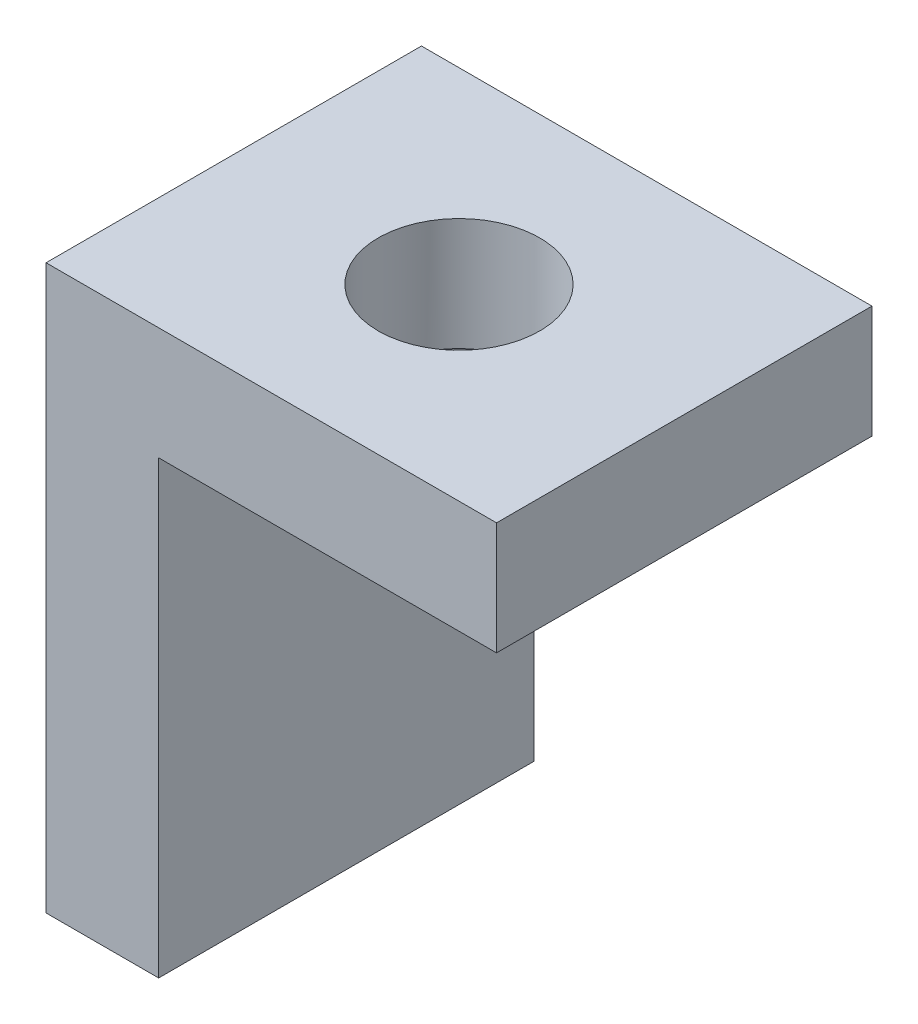
ISO-10303-21;
HEADER;
FILE_DESCRIPTION(('STEP AP214'),'2;1');
FILE_NAME('part.step','',(''),(''),'','','');
FILE_SCHEMA(('AUTOMOTIVE_DESIGN { 1 0 10303 214 1 1 1 1 }'));
ENDSEC;
DATA;
#1=APPLICATION_CONTEXT('core data for automotive mechanical design processes');
#2=APPLICATION_PROTOCOL_DEFINITION('international standard','automotive_design',2000,#1);
#3=PRODUCT_CONTEXT('',#1,'mechanical');
#4=PRODUCT('Part','Part','',(#3));
#5=PRODUCT_RELATED_PRODUCT_CATEGORY('part','',(#4));
#6=PRODUCT_DEFINITION_FORMATION('','',#4);
#7=PRODUCT_DEFINITION_CONTEXT('part definition',#1,'design');
#8=PRODUCT_DEFINITION('design','',#6,#7);
#9=PRODUCT_DEFINITION_SHAPE('','',#8);
#10=(LENGTH_UNIT() NAMED_UNIT(*) SI_UNIT(.MILLI.,.METRE.));
#11=(NAMED_UNIT(*) PLANE_ANGLE_UNIT() SI_UNIT($,.RADIAN.));
#12=(NAMED_UNIT(*) SI_UNIT($,.STERADIAN.) SOLID_ANGLE_UNIT());
#13=UNCERTAINTY_MEASURE_WITH_UNIT(LENGTH_MEASURE(1.E-05),#10,'distance_accuracy_value','');
#14=(GEOMETRIC_REPRESENTATION_CONTEXT(3) GLOBAL_UNCERTAINTY_ASSIGNED_CONTEXT((#13)) GLOBAL_UNIT_ASSIGNED_CONTEXT((#10,
#11,#12)) REPRESENTATION_CONTEXT('',''));
#15=CARTESIAN_POINT('',(0.,0.,0.));
#16=DIRECTION('',(0.,0.,1.));
#17=DIRECTION('',(1.,0.,0.));
#18=AXIS2_PLACEMENT_3D('',#15,#16,#17);
#19=CARTESIAN_POINT('',(-9.,12.,10.));
#20=DIRECTION('',(-1.,0.,0.));
#21=DIRECTION('',(0.,-1.,0.));
#22=AXIS2_PLACEMENT_3D('',#19,#20,#21);
#23=PLANE('',#22);
#24=DIRECTION('',(0.,1.,0.));
#25=VECTOR('',#24,1.);
#26=CARTESIAN_POINT('',(-9.,12.,0.));
#27=LINE('',#26,#25);
#28=CARTESIAN_POINT('',(-9.,0.,0.));
#29=VERTEX_POINT('',#28);
#30=CARTESIAN_POINT('',(-9.,12.,0.));
#31=VERTEX_POINT('',#30);
#32=EDGE_CURVE('E154',#29,#31,#27,.T.);
#33=ORIENTED_EDGE('',*,*,#32,.T.);
#34=DIRECTION('',(0.,0.,-1.));
#35=VECTOR('',#34,1.);
#36=CARTESIAN_POINT('',(-9.,12.,10.));
#37=LINE('',#36,#35);
#38=CARTESIAN_POINT('',(-9.,12.,10.));
#39=VERTEX_POINT('',#38);
#40=EDGE_CURVE('E13',#39,#31,#37,.T.);
#41=ORIENTED_EDGE('',*,*,#40,.F.);
#42=DIRECTION('',(0.,1.,0.));
#43=VECTOR('',#42,1.);
#44=CARTESIAN_POINT('',(-9.,12.,10.));
#45=LINE('',#44,#43);
#46=CARTESIAN_POINT('',(-9.,0.,10.));
#47=VERTEX_POINT('',#46);
#48=EDGE_CURVE('E169',#47,#39,#45,.T.);
#49=ORIENTED_EDGE('',*,*,#48,.F.);
#50=DIRECTION('',(0.,0.,-1.));
#51=VECTOR('',#50,1.);
#52=CARTESIAN_POINT('',(-9.,0.,10.));
#53=LINE('',#52,#51);
#54=EDGE_CURVE('E150',#47,#29,#53,.T.);
#55=ORIENTED_EDGE('',*,*,#54,.T.);
#56=EDGE_LOOP('',(#33,#41,#49,#55));
#57=FACE_BOUND('',#56,.T.);
#58=ADVANCED_FACE('F54',(#57),#23,.F.);
#59=CARTESIAN_POINT('',(0.,12.,10.));
#60=DIRECTION('',(0.,1.,0.));
#61=DIRECTION('',(-1.,0.,0.));
#62=AXIS2_PLACEMENT_3D('',#59,#60,#61);
#63=PLANE('',#62);
#64=CARTESIAN_POINT('',(-6.,12.,5.));
#65=DIRECTION('',(0.,1.,0.));
#66=DIRECTION('',(-1.,0.,0.));
#67=AXIS2_PLACEMENT_3D('',#64,#65,#66);
#68=CIRCLE('',#67,2.14999999999999);
#69=CARTESIAN_POINT('',(-8.14999999999999,12.,5.));
#70=VERTEX_POINT('',#69);
#71=EDGE_CURVE('E57',#70,#70,#68,.T.);
#72=ORIENTED_EDGE('',*,*,#71,.T.);
#73=EDGE_LOOP('',(#72));
#74=FACE_BOUND('',#73,.T.);
#75=DIRECTION('',(1.,0.,0.));
#76=VECTOR('',#75,1.);
#77=CARTESIAN_POINT('',(0.,12.,0.));
#78=LINE('',#77,#76);
#79=CARTESIAN_POINT('',(0.,12.,0.));
#80=VERTEX_POINT('',#79);
#81=EDGE_CURVE('E158',#31,#80,#78,.T.);
#82=ORIENTED_EDGE('',*,*,#81,.T.);
#83=DIRECTION('',(0.,0.,-1.));
#84=VECTOR('',#83,1.);
#85=CARTESIAN_POINT('',(0.,12.,10.));
#86=LINE('',#85,#84);
#87=CARTESIAN_POINT('',(0.,12.,10.));
#88=VERTEX_POINT('',#87);
#89=EDGE_CURVE('E64',#88,#80,#86,.T.);
#90=ORIENTED_EDGE('',*,*,#89,.F.);
#91=DIRECTION('',(1.,0.,0.));
#92=VECTOR('',#91,1.);
#93=CARTESIAN_POINT('',(0.,12.,10.));
#94=LINE('',#93,#92);
#95=EDGE_CURVE('E118',#39,#88,#94,.T.);
#96=ORIENTED_EDGE('',*,*,#95,.F.);
#97=ORIENTED_EDGE('',*,*,#40,.T.);
#98=EDGE_LOOP('',(#82,#90,#96,#97));
#99=FACE_BOUND('',#98,.T.);
#100=ADVANCED_FACE('F197',(#74,#99),#63,.F.);
#101=CARTESIAN_POINT('',(0.,15.,10.));
#102=DIRECTION('',(-1.,0.,0.));
#103=DIRECTION('',(0.,-1.,0.));
#104=AXIS2_PLACEMENT_3D('',#101,#102,#103);
#105=PLANE('',#104);
#106=DIRECTION('',(0.,1.,0.));
#107=VECTOR('',#106,1.);
#108=CARTESIAN_POINT('',(0.,15.,0.));
#109=LINE('',#108,#107);
#110=CARTESIAN_POINT('',(0.,15.,0.));
#111=VERTEX_POINT('',#110);
#112=EDGE_CURVE('E161',#80,#111,#109,.T.);
#113=ORIENTED_EDGE('',*,*,#112,.T.);
#114=DIRECTION('',(0.,0.,-1.));
#115=VECTOR('',#114,1.);
#116=CARTESIAN_POINT('',(0.,15.,10.));
#117=LINE('',#116,#115);
#118=CARTESIAN_POINT('',(0.,15.,10.));
#119=VERTEX_POINT('',#118);
#120=EDGE_CURVE('E142',#119,#111,#117,.T.);
#121=ORIENTED_EDGE('',*,*,#120,.F.);
#122=DIRECTION('',(0.,1.,0.));
#123=VECTOR('',#122,1.);
#124=CARTESIAN_POINT('',(0.,15.,10.));
#125=LINE('',#124,#123);
#126=EDGE_CURVE('E131',#88,#119,#125,.T.);
#127=ORIENTED_EDGE('',*,*,#126,.F.);
#128=ORIENTED_EDGE('',*,*,#89,.T.);
#129=EDGE_LOOP('',(#113,#121,#127,#128));
#130=FACE_BOUND('',#129,.T.);
#131=ADVANCED_FACE('F179',(#130),#105,.F.);
#132=CARTESIAN_POINT('',(-12.,15.,10.));
#133=DIRECTION('',(0.,-1.,0.));
#134=DIRECTION('',(0.,0.,-1.));
#135=AXIS2_PLACEMENT_3D('',#132,#133,#134);
#136=PLANE('',#135);
#137=CARTESIAN_POINT('',(-6.,15.,5.));
#138=DIRECTION('',(0.,1.,0.));
#139=DIRECTION('',(0.,0.,1.));
#140=AXIS2_PLACEMENT_3D('',#137,#138,#139);
#141=CIRCLE('',#140,2.14999999999999);
#142=CARTESIAN_POINT('',(-6.,15.,7.14999999999999));
#143=VERTEX_POINT('',#142);
#144=EDGE_CURVE('E214',#143,#143,#141,.T.);
#145=ORIENTED_EDGE('',*,*,#144,.F.);
#146=EDGE_LOOP('',(#145));
#147=FACE_BOUND('',#146,.T.);
#148=DIRECTION('',(-1.,0.,0.));
#149=VECTOR('',#148,1.);
#150=CARTESIAN_POINT('',(-12.,15.,0.));
#151=LINE('',#150,#149);
#152=CARTESIAN_POINT('',(-12.,15.,0.));
#153=VERTEX_POINT('',#152);
#154=EDGE_CURVE('E140',#111,#153,#151,.T.);
#155=ORIENTED_EDGE('',*,*,#154,.T.);
#156=DIRECTION('',(0.,0.,-1.));
#157=VECTOR('',#156,1.);
#158=CARTESIAN_POINT('',(-12.,15.,10.));
#159=LINE('',#158,#157);
#160=CARTESIAN_POINT('',(-12.,15.,10.));
#161=VERTEX_POINT('',#160);
#162=EDGE_CURVE('E137',#161,#153,#159,.T.);
#163=ORIENTED_EDGE('',*,*,#162,.F.);
#164=DIRECTION('',(-1.,0.,0.));
#165=VECTOR('',#164,1.);
#166=CARTESIAN_POINT('',(-12.,15.,10.));
#167=LINE('',#166,#165);
#168=EDGE_CURVE('E125',#119,#161,#167,.T.);
#169=ORIENTED_EDGE('',*,*,#168,.F.);
#170=ORIENTED_EDGE('',*,*,#120,.T.);
#171=EDGE_LOOP('',(#155,#163,#169,#170));
#172=FACE_BOUND('',#171,.T.);
#173=ADVANCED_FACE('F138',(#147,#172),#136,.F.);
#174=CARTESIAN_POINT('',(-12.,0.,10.));
#175=DIRECTION('',(1.,0.,0.));
#176=DIRECTION('',(0.,0.,-1.));
#177=AXIS2_PLACEMENT_3D('',#174,#175,#176);
#178=PLANE('',#177);
#179=DIRECTION('',(0.,-1.,0.));
#180=VECTOR('',#179,1.);
#181=CARTESIAN_POINT('',(-12.,0.,0.));
#182=LINE('',#181,#180);
#183=CARTESIAN_POINT('',(-12.,0.,0.));
#184=VERTEX_POINT('',#183);
#185=EDGE_CURVE('E101',#153,#184,#182,.T.);
#186=ORIENTED_EDGE('',*,*,#185,.T.);
#187=DIRECTION('',(0.,0.,-1.));
#188=VECTOR('',#187,1.);
#189=CARTESIAN_POINT('',(-12.,0.,10.));
#190=LINE('',#189,#188);
#191=CARTESIAN_POINT('',(-12.,0.,10.));
#192=VERTEX_POINT('',#191);
#193=EDGE_CURVE('E143',#192,#184,#190,.T.);
#194=ORIENTED_EDGE('',*,*,#193,.F.);
#195=DIRECTION('',(0.,-1.,0.));
#196=VECTOR('',#195,1.);
#197=CARTESIAN_POINT('',(-12.,0.,10.));
#198=LINE('',#197,#196);
#199=EDGE_CURVE('E129',#161,#192,#198,.T.);
#200=ORIENTED_EDGE('',*,*,#199,.F.);
#201=ORIENTED_EDGE('',*,*,#162,.T.);
#202=EDGE_LOOP('',(#186,#194,#200,#201));
#203=FACE_BOUND('',#202,.T.);
#204=ADVANCED_FACE('F145',(#203),#178,.F.);
#205=CARTESIAN_POINT('',(-9.,0.,10.));
#206=DIRECTION('',(0.,1.,0.));
#207=DIRECTION('',(-1.,0.,0.));
#208=AXIS2_PLACEMENT_3D('',#205,#206,#207);
#209=PLANE('',#208);
#210=DIRECTION('',(1.,0.,0.));
#211=VECTOR('',#210,1.);
#212=CARTESIAN_POINT('',(-9.,0.,0.));
#213=LINE('',#212,#211);
#214=EDGE_CURVE('E109',#184,#29,#213,.T.);
#215=ORIENTED_EDGE('',*,*,#214,.T.);
#216=ORIENTED_EDGE('',*,*,#54,.F.);
#217=DIRECTION('',(1.,0.,0.));
#218=VECTOR('',#217,1.);
#219=CARTESIAN_POINT('',(-9.,0.,10.));
#220=LINE('',#219,#218);
#221=EDGE_CURVE('E75',#192,#47,#220,.T.);
#222=ORIENTED_EDGE('',*,*,#221,.F.);
#223=ORIENTED_EDGE('',*,*,#193,.T.);
#224=EDGE_LOOP('',(#215,#216,#222,#223));
#225=FACE_BOUND('',#224,.T.);
#226=ADVANCED_FACE('F186',(#225),#209,.F.);
#227=CARTESIAN_POINT('',(0.,0.,10.));
#228=DIRECTION('',(0.,0.,-1.));
#229=DIRECTION('',(-1.,0.,0.));
#230=AXIS2_PLACEMENT_3D('',#227,#228,#229);
#231=PLANE('',#230);
#232=ORIENTED_EDGE('',*,*,#48,.T.);
#233=ORIENTED_EDGE('',*,*,#95,.T.);
#234=ORIENTED_EDGE('',*,*,#126,.T.);
#235=ORIENTED_EDGE('',*,*,#168,.T.);
#236=ORIENTED_EDGE('',*,*,#199,.T.);
#237=ORIENTED_EDGE('',*,*,#221,.T.);
#238=EDGE_LOOP('',(#232,#233,#234,#235,#236,#237));
#239=FACE_BOUND('',#238,.T.);
#240=ADVANCED_FACE('F127',(#239),#231,.F.);
#241=CARTESIAN_POINT('',(0.,0.,0.));
#242=DIRECTION('',(0.,0.,-1.));
#243=DIRECTION('',(-1.,0.,0.));
#244=AXIS2_PLACEMENT_3D('',#241,#242,#243);
#245=PLANE('',#244);
#246=ORIENTED_EDGE('',*,*,#32,.F.);
#247=ORIENTED_EDGE('',*,*,#214,.F.);
#248=ORIENTED_EDGE('',*,*,#185,.F.);
#249=ORIENTED_EDGE('',*,*,#154,.F.);
#250=ORIENTED_EDGE('',*,*,#112,.F.);
#251=ORIENTED_EDGE('',*,*,#81,.F.);
#252=EDGE_LOOP('',(#246,#247,#248,#249,#250,#251));
#253=FACE_BOUND('',#252,.T.);
#254=ADVANCED_FACE('F182',(#253),#245,.T.);
#255=CARTESIAN_POINT('',(-6.,15.,5.));
#256=DIRECTION('',(0.,1.,0.));
#257=DIRECTION('',(0.,0.,1.));
#258=AXIS2_PLACEMENT_3D('',#255,#256,#257);
#259=CYLINDRICAL_SURFACE('',#258,2.14999999999999);
#260=ORIENTED_EDGE('',*,*,#144,.T.);
#261=EDGE_LOOP('',(#260));
#262=FACE_BOUND('',#261,.T.);
#263=ORIENTED_EDGE('',*,*,#71,.F.);
#264=EDGE_LOOP('',(#263));
#265=FACE_BOUND('',#264,.T.);
#266=ADVANCED_FACE('F225',(#262,#265),#259,.F.);
#267=CLOSED_SHELL('',(#58,#100,#131,#173,#204,#226,#240,#254,#266));
#268=MANIFOLD_SOLID_BREP('B2',#267);
#269=ADVANCED_BREP_SHAPE_REPRESENTATION('',(#18,#268),#14);
#270=SHAPE_DEFINITION_REPRESENTATION(#9,#269);
ENDSEC;
END-ISO-10303-21;
